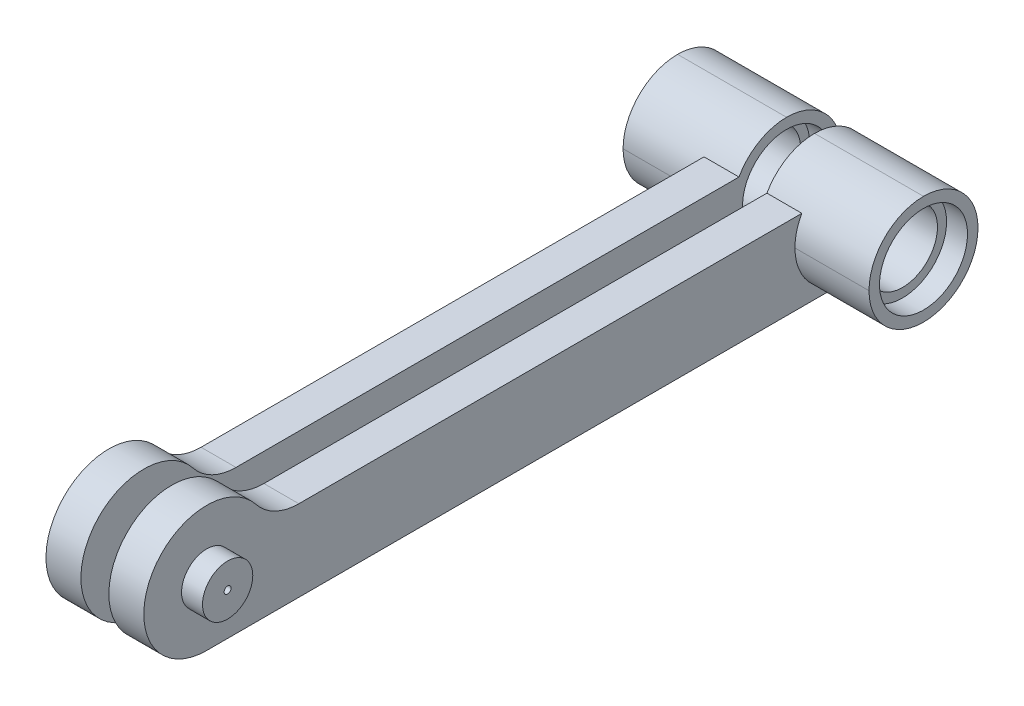
ISO-10303-21;
HEADER;
FILE_DESCRIPTION(('STEP AP214'),'2;1');
FILE_NAME('part.step','',(''),(''),'','','');
FILE_SCHEMA(('AUTOMOTIVE_DESIGN { 1 0 10303 214 1 1 1 1 }'));
ENDSEC;
DATA;
#1=APPLICATION_CONTEXT('core data for automotive mechanical design processes');
#2=APPLICATION_PROTOCOL_DEFINITION('international standard','automotive_design',2000,#1);
#3=PRODUCT_CONTEXT('',#1,'mechanical');
#4=PRODUCT('Part','Part','',(#3));
#5=PRODUCT_RELATED_PRODUCT_CATEGORY('part','',(#4));
#6=PRODUCT_DEFINITION_FORMATION('','',#4);
#7=PRODUCT_DEFINITION_CONTEXT('part definition',#1,'design');
#8=PRODUCT_DEFINITION('design','',#6,#7);
#9=PRODUCT_DEFINITION_SHAPE('','',#8);
#10=(LENGTH_UNIT() NAMED_UNIT(*) SI_UNIT(.MILLI.,.METRE.));
#11=(NAMED_UNIT(*) PLANE_ANGLE_UNIT() SI_UNIT($,.RADIAN.));
#12=(NAMED_UNIT(*) SI_UNIT($,.STERADIAN.) SOLID_ANGLE_UNIT());
#13=UNCERTAINTY_MEASURE_WITH_UNIT(LENGTH_MEASURE(1.E-05),#10,'distance_accuracy_value','');
#14=(GEOMETRIC_REPRESENTATION_CONTEXT(3) GLOBAL_UNCERTAINTY_ASSIGNED_CONTEXT((#13)) GLOBAL_UNIT_ASSIGNED_CONTEXT((#10,
#11,#12)) REPRESENTATION_CONTEXT('',''));
#15=CARTESIAN_POINT('',(0.,0.,0.));
#16=DIRECTION('',(0.,0.,1.));
#17=DIRECTION('',(1.,0.,0.));
#18=AXIS2_PLACEMENT_3D('',#15,#16,#17);
#19=CARTESIAN_POINT('',(-2.,0.,0.));
#20=DIRECTION('',(-1.,0.,0.));
#21=DIRECTION('',(0.,0.,-1.));
#22=AXIS2_PLACEMENT_3D('',#19,#20,#21);
#23=PLANE('',#22);
#24=CARTESIAN_POINT('',(-2.,-0.6,-46.));
#25=DIRECTION('',(1.,0.,0.));
#26=DIRECTION('',(0.,0.,-1.));
#27=AXIS2_PLACEMENT_3D('',#24,#25,#26);
#28=CIRCLE('',#27,3.15);
#29=CARTESIAN_POINT('',(-2.,-0.6,-49.15));
#30=VERTEX_POINT('',#29);
#31=EDGE_CURVE('E226',#30,#30,#28,.T.);
#32=ORIENTED_EDGE('',*,*,#31,.F.);
#33=EDGE_LOOP('',(#32));
#34=FACE_BOUND('',#33,.T.);
#35=DIRECTION('',(0.,0.,1.));
#36=VECTOR('',#35,1.);
#37=CARTESIAN_POINT('',(-2.,1.3,0.));
#38=LINE('',#37,#36);
#39=CARTESIAN_POINT('',(-2.,1.3,-42.5941227268147));
#40=VERTEX_POINT('',#39);
#41=CARTESIAN_POINT('',(-2.,1.3,-6.59696900098826));
#42=VERTEX_POINT('',#41);
#43=EDGE_CURVE('E212',#40,#42,#38,.T.);
#44=ORIENTED_EDGE('',*,*,#43,.T.);
#45=CARTESIAN_POINT('',(-2.,5.2,-6.59696900098826));
#46=DIRECTION('',(1.,0.,0.));
#47=DIRECTION('',(0.,0.,-1.));
#48=AXIS2_PLACEMENT_3D('',#45,#46,#47);
#49=CIRCLE('',#48,3.9);
#50=CARTESIAN_POINT('',(-2.,2.78571428571429,-3.53409053624371));
#51=VERTEX_POINT('',#50);
#52=EDGE_CURVE('E169',#51,#42,#49,.T.);
#53=ORIENTED_EDGE('',*,*,#52,.F.);
#54=CARTESIAN_POINT('',(-2.,0.,0.));
#55=DIRECTION('',(1.,0.,0.));
#56=DIRECTION('',(0.,0.,-1.));
#57=AXIS2_PLACEMENT_3D('',#54,#55,#56);
#58=CIRCLE('',#57,4.5);
#59=CARTESIAN_POINT('',(-2.,-4.5,0.));
#60=VERTEX_POINT('',#59);
#61=EDGE_CURVE('E147',#51,#60,#58,.T.);
#62=ORIENTED_EDGE('',*,*,#61,.T.);
#63=DIRECTION('',(0.,0.,-1.));
#64=VECTOR('',#63,1.);
#65=CARTESIAN_POINT('',(-2.,-4.5,0.));
#66=LINE('',#65,#64);
#67=CARTESIAN_POINT('',(-2.,-4.5,-46.));
#68=VERTEX_POINT('',#67);
#69=EDGE_CURVE('E157',#60,#68,#66,.T.);
#70=ORIENTED_EDGE('',*,*,#69,.T.);
#71=CARTESIAN_POINT('',(-2.,-0.6,-46.));
#72=DIRECTION('',(1.,0.,0.));
#73=DIRECTION('',(0.,0.,-1.));
#74=AXIS2_PLACEMENT_3D('',#71,#72,#73);
#75=CIRCLE('',#74,3.9);
#76=CARTESIAN_POINT('',(-2.,-0.6,-49.9));
#77=VERTEX_POINT('',#76);
#78=EDGE_CURVE('E196',#77,#68,#75,.F.);
#79=ORIENTED_EDGE('',*,*,#78,.F.);
#80=CARTESIAN_POINT('',(-2.,-0.6,-46.));
#81=DIRECTION('',(1.,0.,0.));
#82=DIRECTION('',(0.,0.,-1.));
#83=AXIS2_PLACEMENT_3D('',#80,#81,#82);
#84=CIRCLE('',#83,3.9);
#85=CARTESIAN_POINT('',(-2.,3.3,-46.));
#86=VERTEX_POINT('',#85);
#87=EDGE_CURVE('E193',#86,#77,#84,.F.);
#88=ORIENTED_EDGE('',*,*,#87,.F.);
#89=CARTESIAN_POINT('',(-2.,-0.6,-46.));
#90=DIRECTION('',(1.,0.,0.));
#91=DIRECTION('',(0.,0.,-1.));
#92=AXIS2_PLACEMENT_3D('',#89,#90,#91);
#93=CIRCLE('',#92,3.9);
#94=EDGE_CURVE('E198',#40,#86,#93,.F.);
#95=ORIENTED_EDGE('',*,*,#94,.F.);
#96=EDGE_LOOP('',(#44,#53,#62,#70,#79,#88,#95));
#97=FACE_BOUND('',#96,.T.);
#98=ADVANCED_FACE('F74',(#34,#97),#23,.F.);
#99=CARTESIAN_POINT('',(-4.5,0.,0.));
#100=DIRECTION('',(-1.,0.,0.));
#101=DIRECTION('',(0.,0.,-1.));
#102=AXIS2_PLACEMENT_3D('',#99,#100,#101);
#103=PLANE('',#102);
#104=CARTESIAN_POINT('',(-4.5,0.,0.));
#105=DIRECTION('',(1.,0.,0.));
#106=DIRECTION('',(0.,0.,-1.));
#107=AXIS2_PLACEMENT_3D('',#104,#105,#106);
#108=CIRCLE('',#107,1.8);
#109=CARTESIAN_POINT('',(-4.5,0.,-1.8));
#110=VERTEX_POINT('',#109);
#111=EDGE_CURVE('E240',#110,#110,#108,.T.);
#112=ORIENTED_EDGE('',*,*,#111,.T.);
#113=EDGE_LOOP('',(#112));
#114=FACE_BOUND('',#113,.T.);
#115=DIRECTION('',(0.,0.,-1.));
#116=VECTOR('',#115,1.);
#117=CARTESIAN_POINT('',(-4.5,1.3,0.));
#118=LINE('',#117,#116);
#119=CARTESIAN_POINT('',(-4.5,1.3,-6.59696900098826));
#120=VERTEX_POINT('',#119);
#121=CARTESIAN_POINT('',(-4.5,1.3,-42.5941227268147));
#122=VERTEX_POINT('',#121);
#123=EDGE_CURVE('E213',#120,#122,#118,.T.);
#124=ORIENTED_EDGE('',*,*,#123,.T.);
#125=CARTESIAN_POINT('',(-4.5,-0.6,-46.));
#126=DIRECTION('',(1.,0.,0.));
#127=DIRECTION('',(0.,0.,-1.));
#128=AXIS2_PLACEMENT_3D('',#125,#126,#127);
#129=CIRCLE('',#128,3.9);
#130=CARTESIAN_POINT('',(-4.5,-0.6,-42.1));
#131=VERTEX_POINT('',#130);
#132=EDGE_CURVE('E83',#131,#122,#129,.F.);
#133=ORIENTED_EDGE('',*,*,#132,.F.);
#134=CARTESIAN_POINT('',(-4.5,-0.6,-46.));
#135=DIRECTION('',(1.,0.,0.));
#136=DIRECTION('',(0.,0.,-1.));
#137=AXIS2_PLACEMENT_3D('',#134,#135,#136);
#138=CIRCLE('',#137,3.9);
#139=CARTESIAN_POINT('',(-4.5,-4.5,-46.));
#140=VERTEX_POINT('',#139);
#141=EDGE_CURVE('E205',#140,#131,#138,.F.);
#142=ORIENTED_EDGE('',*,*,#141,.F.);
#143=DIRECTION('',(0.,0.,-1.));
#144=VECTOR('',#143,1.);
#145=CARTESIAN_POINT('',(-4.5,-4.5,0.));
#146=LINE('',#145,#144);
#147=CARTESIAN_POINT('',(-4.5,-4.5,0.));
#148=VERTEX_POINT('',#147);
#149=EDGE_CURVE('E164',#148,#140,#146,.T.);
#150=ORIENTED_EDGE('',*,*,#149,.F.);
#151=CARTESIAN_POINT('',(-4.5,0.,0.));
#152=DIRECTION('',(1.,0.,0.));
#153=DIRECTION('',(0.,0.,-1.));
#154=AXIS2_PLACEMENT_3D('',#151,#152,#153);
#155=CIRCLE('',#154,4.5);
#156=CARTESIAN_POINT('',(-4.5,2.78571428571429,-3.53409053624371));
#157=VERTEX_POINT('',#156);
#158=EDGE_CURVE('E150',#157,#148,#155,.T.);
#159=ORIENTED_EDGE('',*,*,#158,.F.);
#160=CARTESIAN_POINT('',(-4.5,5.2,-6.59696900098826));
#161=DIRECTION('',(1.,0.,0.));
#162=DIRECTION('',(0.,0.,-1.));
#163=AXIS2_PLACEMENT_3D('',#160,#161,#162);
#164=CIRCLE('',#163,3.9);
#165=EDGE_CURVE('E202',#120,#157,#164,.F.);
#166=ORIENTED_EDGE('',*,*,#165,.F.);
#167=EDGE_LOOP('',(#124,#133,#142,#150,#159,#166));
#168=FACE_BOUND('',#167,.T.);
#169=ADVANCED_FACE('F245',(#114,#168),#103,.T.);
#170=CARTESIAN_POINT('',(-9.8,-0.6,-46.));
#171=DIRECTION('',(1.,0.,0.));
#172=DIRECTION('',(0.,0.,1.));
#173=AXIS2_PLACEMENT_3D('',#170,#171,#172);
#174=CYLINDRICAL_SURFACE('',#173,2.5);
#175=CARTESIAN_POINT('',(-3.5,-0.6,-46.));
#176=DIRECTION('',(1.,0.,0.));
#177=DIRECTION('',(0.,0.,-1.));
#178=AXIS2_PLACEMENT_3D('',#175,#176,#177);
#179=CIRCLE('',#178,2.5);
#180=CARTESIAN_POINT('',(-3.5,-0.6,-48.5));
#181=VERTEX_POINT('',#180);
#182=EDGE_CURVE('E229',#181,#181,#179,.T.);
#183=ORIENTED_EDGE('',*,*,#182,.T.);
#184=EDGE_LOOP('',(#183));
#185=FACE_BOUND('',#184,.T.);
#186=CARTESIAN_POINT('',(-8.3,-0.6,-46.));
#187=DIRECTION('',(1.,0.,0.));
#188=DIRECTION('',(0.,0.,-1.));
#189=AXIS2_PLACEMENT_3D('',#186,#187,#188);
#190=CIRCLE('',#189,2.5);
#191=CARTESIAN_POINT('',(-8.3,-0.6,-48.5));
#192=VERTEX_POINT('',#191);
#193=EDGE_CURVE('E217',#192,#192,#190,.T.);
#194=ORIENTED_EDGE('',*,*,#193,.F.);
#195=EDGE_LOOP('',(#194));
#196=FACE_BOUND('',#195,.T.);
#197=ADVANCED_FACE('F270',(#185,#196),#174,.F.);
#198=CARTESIAN_POINT('',(-4.5,0.,0.));
#199=DIRECTION('',(1.,0.,0.));
#200=DIRECTION('',(0.,0.,1.));
#201=AXIS2_PLACEMENT_3D('',#198,#199,#200);
#202=CYLINDRICAL_SURFACE('',#201,4.5);
#203=ORIENTED_EDGE('',*,*,#158,.T.);
#204=DIRECTION('',(1.,0.,0.));
#205=VECTOR('',#204,1.);
#206=CARTESIAN_POINT('',(-4.5,-4.5,0.));
#207=LINE('',#206,#205);
#208=EDGE_CURVE('E143',#148,#60,#207,.T.);
#209=ORIENTED_EDGE('',*,*,#208,.T.);
#210=ORIENTED_EDGE('',*,*,#61,.F.);
#211=DIRECTION('',(1.,0.,0.));
#212=VECTOR('',#211,1.);
#213=CARTESIAN_POINT('',(-4.5,2.78571428571429,-3.53409053624371));
#214=LINE('',#213,#212);
#215=EDGE_CURVE('E177',#157,#51,#214,.T.);
#216=ORIENTED_EDGE('',*,*,#215,.F.);
#217=EDGE_LOOP('',(#203,#209,#210,#216));
#218=FACE_BOUND('',#217,.T.);
#219=ADVANCED_FACE('F145',(#218),#202,.T.);
#220=CARTESIAN_POINT('',(-4.5,-4.5,0.));
#221=DIRECTION('',(0.,1.,0.));
#222=DIRECTION('',(0.,0.,1.));
#223=AXIS2_PLACEMENT_3D('',#220,#221,#222);
#224=PLANE('',#223);
#225=DIRECTION('',(1.,0.,0.));
#226=VECTOR('',#225,1.);
#227=CARTESIAN_POINT('',(-4.5,-4.5,-46.));
#228=LINE('',#227,#226);
#229=EDGE_CURVE('E160',#68,#140,#228,.F.);
#230=ORIENTED_EDGE('',*,*,#229,.F.);
#231=ORIENTED_EDGE('',*,*,#69,.F.);
#232=ORIENTED_EDGE('',*,*,#208,.F.);
#233=ORIENTED_EDGE('',*,*,#149,.T.);
#234=EDGE_LOOP('',(#230,#231,#232,#233));
#235=FACE_BOUND('',#234,.T.);
#236=ADVANCED_FACE('F158',(#235),#224,.F.);
#237=CARTESIAN_POINT('',(-6.,0.,0.));
#238=DIRECTION('',(-1.,0.,0.));
#239=DIRECTION('',(0.,0.,-1.));
#240=AXIS2_PLACEMENT_3D('',#237,#238,#239);
#241=PLANE('',#240);
#242=CARTESIAN_POINT('',(-6.,0.,0.));
#243=DIRECTION('',(1.,0.,0.));
#244=DIRECTION('',(0.,0.,-1.));
#245=AXIS2_PLACEMENT_3D('',#242,#243,#244);
#246=CIRCLE('',#245,1.8);
#247=CARTESIAN_POINT('',(-6.,0.,-1.8));
#248=VERTEX_POINT('',#247);
#249=EDGE_CURVE('E165',#248,#248,#246,.T.);
#250=ORIENTED_EDGE('',*,*,#249,.F.);
#251=EDGE_LOOP('',(#250));
#252=FACE_BOUND('',#251,.T.);
#253=CARTESIAN_POINT('',(-6.,0.,0.));
#254=DIRECTION('',(1.,0.,0.));
#255=DIRECTION('',(0.,0.,-1.));
#256=AXIS2_PLACEMENT_3D('',#253,#254,#255);
#257=CIRCLE('',#256,0.25);
#258=CARTESIAN_POINT('',(-6.,0.,-0.25));
#259=VERTEX_POINT('',#258);
#260=EDGE_CURVE('E235',#259,#259,#257,.T.);
#261=ORIENTED_EDGE('',*,*,#260,.T.);
#262=EDGE_LOOP('',(#261));
#263=FACE_BOUND('',#262,.T.);
#264=ADVANCED_FACE('F251',(#252,#263),#241,.T.);
#265=CARTESIAN_POINT('',(-6.,0.,0.));
#266=DIRECTION('',(1.,0.,0.));
#267=DIRECTION('',(0.,0.,1.));
#268=AXIS2_PLACEMENT_3D('',#265,#266,#267);
#269=CYLINDRICAL_SURFACE('',#268,1.8);
#270=ORIENTED_EDGE('',*,*,#249,.T.);
#271=EDGE_LOOP('',(#270));
#272=FACE_BOUND('',#271,.T.);
#273=ORIENTED_EDGE('',*,*,#111,.F.);
#274=EDGE_LOOP('',(#273));
#275=FACE_BOUND('',#274,.T.);
#276=ADVANCED_FACE('F248',(#272,#275),#269,.T.);
#277=CARTESIAN_POINT('',(-6.,0.,0.));
#278=DIRECTION('',(1.,0.,0.));
#279=DIRECTION('',(0.,0.,1.));
#280=AXIS2_PLACEMENT_3D('',#277,#278,#279);
#281=CYLINDRICAL_SURFACE('',#280,0.25);
#282=ORIENTED_EDGE('',*,*,#260,.F.);
#283=EDGE_LOOP('',(#282));
#284=FACE_BOUND('',#283,.T.);
#285=CARTESIAN_POINT('',(-4.5,0.,0.));
#286=DIRECTION('',(1.,0.,0.));
#287=DIRECTION('',(0.,0.,-1.));
#288=AXIS2_PLACEMENT_3D('',#285,#286,#287);
#289=CIRCLE('',#288,0.25);
#290=CARTESIAN_POINT('',(-4.5,0.,-0.25));
#291=VERTEX_POINT('',#290);
#292=EDGE_CURVE('E154',#291,#291,#289,.F.);
#293=ORIENTED_EDGE('',*,*,#292,.F.);
#294=EDGE_LOOP('',(#293));
#295=FACE_BOUND('',#294,.T.);
#296=ADVANCED_FACE('F250',(#284,#295),#281,.F.);
#297=ORIENTED_EDGE('',*,*,#292,.T.);
#298=EDGE_LOOP('',(#297));
#299=FACE_BOUND('',#298,.T.);
#300=ADVANCED_FACE('F258',(#299),#103,.T.);
#301=CARTESIAN_POINT('',(-9.8,0.,0.));
#302=DIRECTION('',(-1.,0.,0.));
#303=DIRECTION('',(0.,0.,-1.));
#304=AXIS2_PLACEMENT_3D('',#301,#302,#303);
#305=PLANE('',#304);
#306=CARTESIAN_POINT('',(-9.8,-0.6,-46.));
#307=DIRECTION('',(1.,0.,0.));
#308=DIRECTION('',(0.,0.,-1.));
#309=AXIS2_PLACEMENT_3D('',#306,#307,#308);
#310=CIRCLE('',#309,3.15);
#311=CARTESIAN_POINT('',(-9.8,-0.6,-49.15));
#312=VERTEX_POINT('',#311);
#313=EDGE_CURVE('E222',#312,#312,#310,.T.);
#314=ORIENTED_EDGE('',*,*,#313,.T.);
#315=EDGE_LOOP('',(#314));
#316=FACE_BOUND('',#315,.T.);
#317=CARTESIAN_POINT('',(-9.8,-0.6,-46.));
#318=DIRECTION('',(1.,0.,0.));
#319=DIRECTION('',(0.,0.,-1.));
#320=AXIS2_PLACEMENT_3D('',#317,#318,#319);
#321=CIRCLE('',#320,3.9);
#322=CARTESIAN_POINT('',(-9.8,3.3,-46.));
#323=VERTEX_POINT('',#322);
#324=CARTESIAN_POINT('',(-9.8,-0.6,-42.1));
#325=VERTEX_POINT('',#324);
#326=EDGE_CURVE('E188',#323,#325,#321,.T.);
#327=ORIENTED_EDGE('',*,*,#326,.F.);
#328=CARTESIAN_POINT('',(-9.8,-0.6,-46.));
#329=DIRECTION('',(1.,0.,0.));
#330=DIRECTION('',(0.,0.,-1.));
#331=AXIS2_PLACEMENT_3D('',#328,#329,#330);
#332=CIRCLE('',#331,3.9);
#333=CARTESIAN_POINT('',(-9.8,-0.6,-49.9));
#334=VERTEX_POINT('',#333);
#335=EDGE_CURVE('E182',#334,#323,#332,.T.);
#336=ORIENTED_EDGE('',*,*,#335,.F.);
#337=CARTESIAN_POINT('',(-9.8,-0.6,-46.));
#338=DIRECTION('',(1.,0.,0.));
#339=DIRECTION('',(0.,0.,-1.));
#340=AXIS2_PLACEMENT_3D('',#337,#338,#339);
#341=CIRCLE('',#340,3.9);
#342=CARTESIAN_POINT('',(-9.8,-4.5,-46.));
#343=VERTEX_POINT('',#342);
#344=EDGE_CURVE('E185',#343,#334,#341,.T.);
#345=ORIENTED_EDGE('',*,*,#344,.F.);
#346=CARTESIAN_POINT('',(-9.8,-0.6,-46.));
#347=DIRECTION('',(1.,0.,0.));
#348=DIRECTION('',(0.,0.,-1.));
#349=AXIS2_PLACEMENT_3D('',#346,#347,#348);
#350=CIRCLE('',#349,3.9);
#351=EDGE_CURVE('E190',#325,#343,#350,.T.);
#352=ORIENTED_EDGE('',*,*,#351,.F.);
#353=EDGE_LOOP('',(#327,#336,#345,#352));
#354=FACE_BOUND('',#353,.T.);
#355=ADVANCED_FACE('F303',(#316,#354),#305,.T.);
#356=CARTESIAN_POINT('',(-3.5,-0.6,-46.));
#357=DIRECTION('',(1.,0.,0.));
#358=DIRECTION('',(0.,0.,1.));
#359=AXIS2_PLACEMENT_3D('',#356,#357,#358);
#360=CYLINDRICAL_SURFACE('',#359,3.15);
#361=CARTESIAN_POINT('',(-3.5,-0.6,-46.));
#362=DIRECTION('',(1.,0.,0.));
#363=DIRECTION('',(0.,0.,-1.));
#364=AXIS2_PLACEMENT_3D('',#361,#362,#363);
#365=CIRCLE('',#364,3.15);
#366=CARTESIAN_POINT('',(-3.5,-0.6,-49.15));
#367=VERTEX_POINT('',#366);
#368=EDGE_CURVE('E232',#367,#367,#365,.T.);
#369=ORIENTED_EDGE('',*,*,#368,.F.);
#370=EDGE_LOOP('',(#369));
#371=FACE_BOUND('',#370,.T.);
#372=ORIENTED_EDGE('',*,*,#31,.T.);
#373=EDGE_LOOP('',(#372));
#374=FACE_BOUND('',#373,.T.);
#375=ADVANCED_FACE('F305',(#371,#374),#360,.F.);
#376=CARTESIAN_POINT('',(-3.5,0.,0.));
#377=DIRECTION('',(-1.,0.,0.));
#378=DIRECTION('',(0.,0.,-1.));
#379=AXIS2_PLACEMENT_3D('',#376,#377,#378);
#380=PLANE('',#379);
#381=ORIENTED_EDGE('',*,*,#182,.F.);
#382=EDGE_LOOP('',(#381));
#383=FACE_BOUND('',#382,.T.);
#384=ORIENTED_EDGE('',*,*,#368,.T.);
#385=EDGE_LOOP('',(#384));
#386=FACE_BOUND('',#385,.T.);
#387=ADVANCED_FACE('F312',(#383,#386),#380,.F.);
#388=CARTESIAN_POINT('',(-8.3,-0.6,-46.));
#389=DIRECTION('',(-1.,0.,0.));
#390=DIRECTION('',(0.,0.,-1.));
#391=AXIS2_PLACEMENT_3D('',#388,#389,#390);
#392=CYLINDRICAL_SURFACE('',#391,3.15);
#393=CARTESIAN_POINT('',(-8.3,-0.6,-46.));
#394=DIRECTION('',(1.,0.,0.));
#395=DIRECTION('',(0.,0.,-1.));
#396=AXIS2_PLACEMENT_3D('',#393,#394,#395);
#397=CIRCLE('',#396,3.15);
#398=CARTESIAN_POINT('',(-8.3,-0.6,-49.15));
#399=VERTEX_POINT('',#398);
#400=EDGE_CURVE('E223',#399,#399,#397,.T.);
#401=ORIENTED_EDGE('',*,*,#400,.T.);
#402=EDGE_LOOP('',(#401));
#403=FACE_BOUND('',#402,.T.);
#404=ORIENTED_EDGE('',*,*,#313,.F.);
#405=EDGE_LOOP('',(#404));
#406=FACE_BOUND('',#405,.T.);
#407=ADVANCED_FACE('F322',(#403,#406),#392,.F.);
#408=CARTESIAN_POINT('',(-8.3,-0.6,-46.));
#409=DIRECTION('',(-1.,0.,0.));
#410=DIRECTION('',(0.,0.,-1.));
#411=AXIS2_PLACEMENT_3D('',#408,#409,#410);
#412=PLANE('',#411);
#413=ORIENTED_EDGE('',*,*,#193,.T.);
#414=EDGE_LOOP('',(#413));
#415=FACE_BOUND('',#414,.T.);
#416=ORIENTED_EDGE('',*,*,#400,.F.);
#417=EDGE_LOOP('',(#416));
#418=FACE_BOUND('',#417,.T.);
#419=ADVANCED_FACE('F326',(#415,#418),#412,.T.);
#420=CARTESIAN_POINT('',(-9.8,1.3,0.));
#421=DIRECTION('',(0.,-1.,0.));
#422=DIRECTION('',(0.,0.,-1.));
#423=AXIS2_PLACEMENT_3D('',#420,#421,#422);
#424=PLANE('',#423);
#425=ORIENTED_EDGE('',*,*,#43,.F.);
#426=DIRECTION('',(1.,0.,0.));
#427=VECTOR('',#426,1.);
#428=CARTESIAN_POINT('',(-4.5,1.3,-42.5941227268147));
#429=LINE('',#428,#427);
#430=EDGE_CURVE('E13',#122,#40,#429,.T.);
#431=ORIENTED_EDGE('',*,*,#430,.F.);
#432=ORIENTED_EDGE('',*,*,#123,.F.);
#433=DIRECTION('',(-1.,0.,0.));
#434=VECTOR('',#433,1.);
#435=CARTESIAN_POINT('',(-4.5,1.3,-6.59696900098826));
#436=LINE('',#435,#434);
#437=EDGE_CURVE('E179',#42,#120,#436,.T.);
#438=ORIENTED_EDGE('',*,*,#437,.F.);
#439=EDGE_LOOP('',(#425,#431,#432,#438));
#440=FACE_BOUND('',#439,.T.);
#441=ADVANCED_FACE('F280',(#440),#424,.F.);
#442=CARTESIAN_POINT('',(-4.5,5.2,-6.59696900098826));
#443=DIRECTION('',(1.,0.,0.));
#444=DIRECTION('',(0.,0.,1.));
#445=AXIS2_PLACEMENT_3D('',#442,#443,#444);
#446=CYLINDRICAL_SURFACE('',#445,3.9);
#447=ORIENTED_EDGE('',*,*,#165,.T.);
#448=ORIENTED_EDGE('',*,*,#215,.T.);
#449=ORIENTED_EDGE('',*,*,#52,.T.);
#450=ORIENTED_EDGE('',*,*,#437,.T.);
#451=EDGE_LOOP('',(#447,#448,#449,#450));
#452=FACE_BOUND('',#451,.T.);
#453=ADVANCED_FACE('F277',(#452),#446,.F.);
#454=CARTESIAN_POINT('',(-4.5,-0.6,-46.));
#455=DIRECTION('',(-1.,0.,0.));
#456=DIRECTION('',(0.,0.,-1.));
#457=AXIS2_PLACEMENT_3D('',#454,#455,#456);
#458=CYLINDRICAL_SURFACE('',#457,3.9);
#459=DIRECTION('',(1.,0.,0.));
#460=VECTOR('',#459,1.);
#461=CARTESIAN_POINT('',(-9.8,-0.6,-49.9));
#462=LINE('',#461,#460);
#463=EDGE_CURVE('E210',#77,#334,#462,.F.);
#464=ORIENTED_EDGE('',*,*,#463,.T.);
#465=ORIENTED_EDGE('',*,*,#335,.T.);
#466=DIRECTION('',(1.,0.,0.));
#467=VECTOR('',#466,1.);
#468=CARTESIAN_POINT('',(-2.,3.3,-46.));
#469=LINE('',#468,#467);
#470=EDGE_CURVE('E78',#323,#86,#469,.T.);
#471=ORIENTED_EDGE('',*,*,#470,.T.);
#472=ORIENTED_EDGE('',*,*,#87,.T.);
#473=EDGE_LOOP('',(#464,#465,#471,#472));
#474=FACE_BOUND('',#473,.T.);
#475=ADVANCED_FACE('F76',(#474),#458,.T.);
#476=CARTESIAN_POINT('',(-9.8,-0.6,-46.));
#477=DIRECTION('',(1.,0.,0.));
#478=DIRECTION('',(0.,0.,1.));
#479=AXIS2_PLACEMENT_3D('',#476,#477,#478);
#480=CYLINDRICAL_SURFACE('',#479,3.9);
#481=ORIENTED_EDGE('',*,*,#430,.T.);
#482=ORIENTED_EDGE('',*,*,#94,.T.);
#483=ORIENTED_EDGE('',*,*,#470,.F.);
#484=ORIENTED_EDGE('',*,*,#326,.T.);
#485=DIRECTION('',(1.,0.,0.));
#486=VECTOR('',#485,1.);
#487=CARTESIAN_POINT('',(-9.8,-0.6,-42.1));
#488=LINE('',#487,#486);
#489=EDGE_CURVE('E96',#325,#131,#488,.T.);
#490=ORIENTED_EDGE('',*,*,#489,.T.);
#491=ORIENTED_EDGE('',*,*,#132,.T.);
#492=EDGE_LOOP('',(#481,#482,#483,#484,#490,#491));
#493=FACE_BOUND('',#492,.T.);
#494=ADVANCED_FACE('F288',(#493),#480,.T.);
#495=CARTESIAN_POINT('',(-4.5,-0.6,-46.));
#496=DIRECTION('',(1.,0.,0.));
#497=DIRECTION('',(0.,0.,1.));
#498=AXIS2_PLACEMENT_3D('',#495,#496,#497);
#499=CYLINDRICAL_SURFACE('',#498,3.9);
#500=ORIENTED_EDGE('',*,*,#463,.F.);
#501=ORIENTED_EDGE('',*,*,#78,.T.);
#502=ORIENTED_EDGE('',*,*,#229,.T.);
#503=DIRECTION('',(1.,0.,0.));
#504=VECTOR('',#503,1.);
#505=CARTESIAN_POINT('',(-4.5,-4.5,-46.));
#506=LINE('',#505,#504);
#507=EDGE_CURVE('E208',#140,#343,#506,.F.);
#508=ORIENTED_EDGE('',*,*,#507,.T.);
#509=ORIENTED_EDGE('',*,*,#344,.T.);
#510=EDGE_LOOP('',(#500,#501,#502,#508,#509));
#511=FACE_BOUND('',#510,.T.);
#512=ADVANCED_FACE('F285',(#511),#499,.T.);
#513=CARTESIAN_POINT('',(-4.5,-0.6,-46.));
#514=DIRECTION('',(-1.,0.,0.));
#515=DIRECTION('',(0.,0.,-1.));
#516=AXIS2_PLACEMENT_3D('',#513,#514,#515);
#517=CYLINDRICAL_SURFACE('',#516,3.9);
#518=ORIENTED_EDGE('',*,*,#351,.T.);
#519=ORIENTED_EDGE('',*,*,#507,.F.);
#520=ORIENTED_EDGE('',*,*,#141,.T.);
#521=ORIENTED_EDGE('',*,*,#489,.F.);
#522=EDGE_LOOP('',(#518,#519,#520,#521));
#523=FACE_BOUND('',#522,.T.);
#524=ADVANCED_FACE('F282',(#523),#517,.T.);
#525=CLOSED_SHELL('',(#98,#169,#197,#219,#236,#264,#276,#296,#300,#355,#375,#387,#407,#419,#441,
#453,#475,#494,#512,#524));
#526=MANIFOLD_SOLID_BREP('B2',#525);
#527=CARTESIAN_POINT('',(0.,0.,0.));
#528=DIRECTION('',(1.,0.,0.));
#529=DIRECTION('',(0.,0.,-1.));
#530=AXIS2_PLACEMENT_3D('',#527,#528,#529);
#531=PLANE('',#530);
#532=CARTESIAN_POINT('',(0.,-0.6,-46.));
#533=DIRECTION('',(1.,0.,0.));
#534=DIRECTION('',(0.,0.,-1.));
#535=AXIS2_PLACEMENT_3D('',#532,#533,#534);
#536=CIRCLE('',#535,3.15);
#537=CARTESIAN_POINT('',(0.,-0.6,-49.15));
#538=VERTEX_POINT('',#537);
#539=EDGE_CURVE('E634',#538,#538,#536,.T.);
#540=ORIENTED_EDGE('',*,*,#539,.T.);
#541=EDGE_LOOP('',(#540));
#542=FACE_BOUND('',#541,.T.);
#543=DIRECTION('',(0.,0.,1.));
#544=VECTOR('',#543,1.);
#545=CARTESIAN_POINT('',(0.,1.3,0.));
#546=LINE('',#545,#544);
#547=CARTESIAN_POINT('',(0.,1.3,-42.5941227268147));
#548=VERTEX_POINT('',#547);
#549=CARTESIAN_POINT('',(0.,1.3,-6.59696900098826));
#550=VERTEX_POINT('',#549);
#551=EDGE_CURVE('E617',#548,#550,#546,.T.);
#552=ORIENTED_EDGE('',*,*,#551,.F.);
#553=CARTESIAN_POINT('',(0.,-0.6,-46.));
#554=DIRECTION('',(1.,0.,0.));
#555=DIRECTION('',(0.,0.,-1.));
#556=AXIS2_PLACEMENT_3D('',#553,#554,#555);
#557=CIRCLE('',#556,3.9);
#558=CARTESIAN_POINT('',(0.,3.3,-46.));
#559=VERTEX_POINT('',#558);
#560=EDGE_CURVE('E599',#548,#559,#557,.F.);
#561=ORIENTED_EDGE('',*,*,#560,.T.);
#562=CARTESIAN_POINT('',(0.,-0.6,-46.));
#563=DIRECTION('',(1.,0.,0.));
#564=DIRECTION('',(0.,0.,-1.));
#565=AXIS2_PLACEMENT_3D('',#562,#563,#564);
#566=CIRCLE('',#565,3.9);
#567=CARTESIAN_POINT('',(0.,-0.6,-49.9));
#568=VERTEX_POINT('',#567);
#569=EDGE_CURVE('E596',#559,#568,#566,.F.);
#570=ORIENTED_EDGE('',*,*,#569,.T.);
#571=CARTESIAN_POINT('',(0.,-0.6,-46.));
#572=DIRECTION('',(1.,0.,0.));
#573=DIRECTION('',(0.,0.,-1.));
#574=AXIS2_PLACEMENT_3D('',#571,#572,#573);
#575=CIRCLE('',#574,3.9);
#576=CARTESIAN_POINT('',(0.,-4.5,-46.));
#577=VERTEX_POINT('',#576);
#578=EDGE_CURVE('E572',#568,#577,#575,.F.);
#579=ORIENTED_EDGE('',*,*,#578,.T.);
#580=DIRECTION('',(0.,0.,-1.));
#581=VECTOR('',#580,1.);
#582=CARTESIAN_POINT('',(0.,-4.5,0.));
#583=LINE('',#582,#581);
#584=CARTESIAN_POINT('',(0.,-4.5,0.));
#585=VERTEX_POINT('',#584);
#586=EDGE_CURVE('E567',#585,#577,#583,.T.);
#587=ORIENTED_EDGE('',*,*,#586,.F.);
#588=CARTESIAN_POINT('',(0.,0.,0.));
#589=DIRECTION('',(1.,0.,0.));
#590=DIRECTION('',(0.,0.,-1.));
#591=AXIS2_PLACEMENT_3D('',#588,#589,#590);
#592=CIRCLE('',#591,4.5);
#593=CARTESIAN_POINT('',(0.,2.78571428571429,-3.53409053624371));
#594=VERTEX_POINT('',#593);
#595=EDGE_CURVE('E550',#594,#585,#592,.T.);
#596=ORIENTED_EDGE('',*,*,#595,.F.);
#597=CARTESIAN_POINT('',(0.,5.2,-6.59696900098826));
#598=DIRECTION('',(1.,0.,0.));
#599=DIRECTION('',(0.,0.,-1.));
#600=AXIS2_PLACEMENT_3D('',#597,#598,#599);
#601=CIRCLE('',#600,3.9);
#602=EDGE_CURVE('E601',#594,#550,#601,.T.);
#603=ORIENTED_EDGE('',*,*,#602,.T.);
#604=EDGE_LOOP('',(#552,#561,#570,#579,#587,#596,#603));
#605=FACE_BOUND('',#604,.T.);
#606=ADVANCED_FACE('F477',(#542,#605),#531,.F.);
#607=CARTESIAN_POINT('',(2.5,0.,0.));
#608=DIRECTION('',(1.,0.,0.));
#609=DIRECTION('',(0.,0.,-1.));
#610=AXIS2_PLACEMENT_3D('',#607,#608,#609);
#611=PLANE('',#610);
#612=CARTESIAN_POINT('',(2.5,0.,0.));
#613=DIRECTION('',(1.,0.,0.));
#614=DIRECTION('',(0.,0.,-1.));
#615=AXIS2_PLACEMENT_3D('',#612,#613,#614);
#616=CIRCLE('',#615,1.8);
#617=CARTESIAN_POINT('',(2.5,0.,-1.8));
#618=VERTEX_POINT('',#617);
#619=EDGE_CURVE('E577',#618,#618,#616,.T.);
#620=ORIENTED_EDGE('',*,*,#619,.F.);
#621=EDGE_LOOP('',(#620));
#622=FACE_BOUND('',#621,.T.);
#623=DIRECTION('',(0.,0.,-1.));
#624=VECTOR('',#623,1.);
#625=CARTESIAN_POINT('',(2.5,1.3,0.));
#626=LINE('',#625,#624);
#627=CARTESIAN_POINT('',(2.5,1.3,-6.59696900098826));
#628=VERTEX_POINT('',#627);
#629=CARTESIAN_POINT('',(2.5,1.3,-42.5941227268147));
#630=VERTEX_POINT('',#629);
#631=EDGE_CURVE('E493',#628,#630,#626,.T.);
#632=ORIENTED_EDGE('',*,*,#631,.F.);
#633=CARTESIAN_POINT('',(2.5,5.2,-6.59696900098826));
#634=DIRECTION('',(1.,0.,0.));
#635=DIRECTION('',(0.,0.,-1.));
#636=AXIS2_PLACEMENT_3D('',#633,#634,#635);
#637=CIRCLE('',#636,3.9);
#638=CARTESIAN_POINT('',(2.5,2.78571428571429,-3.53409053624371));
#639=VERTEX_POINT('',#638);
#640=EDGE_CURVE('E603',#628,#639,#637,.F.);
#641=ORIENTED_EDGE('',*,*,#640,.T.);
#642=CARTESIAN_POINT('',(2.5,0.,0.));
#643=DIRECTION('',(1.,0.,0.));
#644=DIRECTION('',(0.,0.,-1.));
#645=AXIS2_PLACEMENT_3D('',#642,#643,#644);
#646=CIRCLE('',#645,4.5);
#647=CARTESIAN_POINT('',(2.5,-4.5,0.));
#648=VERTEX_POINT('',#647);
#649=EDGE_CURVE('E560',#639,#648,#646,.T.);
#650=ORIENTED_EDGE('',*,*,#649,.T.);
#651=DIRECTION('',(0.,0.,-1.));
#652=VECTOR('',#651,1.);
#653=CARTESIAN_POINT('',(2.5,-4.5,0.));
#654=LINE('',#653,#652);
#655=CARTESIAN_POINT('',(2.5,-4.5,-46.));
#656=VERTEX_POINT('',#655);
#657=EDGE_CURVE('E561',#648,#656,#654,.T.);
#658=ORIENTED_EDGE('',*,*,#657,.T.);
#659=CARTESIAN_POINT('',(2.5,-0.6,-46.));
#660=DIRECTION('',(1.,0.,0.));
#661=DIRECTION('',(0.,0.,-1.));
#662=AXIS2_PLACEMENT_3D('',#659,#660,#661);
#663=CIRCLE('',#662,3.9);
#664=CARTESIAN_POINT('',(2.5,-0.6,-42.1));
#665=VERTEX_POINT('',#664);
#666=EDGE_CURVE('E605',#656,#665,#663,.F.);
#667=ORIENTED_EDGE('',*,*,#666,.T.);
#668=CARTESIAN_POINT('',(2.5,-0.6,-46.));
#669=DIRECTION('',(1.,0.,0.));
#670=DIRECTION('',(0.,0.,-1.));
#671=AXIS2_PLACEMENT_3D('',#668,#669,#670);
#672=CIRCLE('',#671,3.9);
#673=EDGE_CURVE('E486',#665,#630,#672,.F.);
#674=ORIENTED_EDGE('',*,*,#673,.T.);
#675=EDGE_LOOP('',(#632,#641,#650,#658,#667,#674));
#676=FACE_BOUND('',#675,.T.);
#677=ADVANCED_FACE('F651',(#622,#676),#611,.T.);
#678=CARTESIAN_POINT('',(7.8,-0.6,-46.));
#679=DIRECTION('',(-1.,0.,0.));
#680=DIRECTION('',(0.,0.,1.));
#681=AXIS2_PLACEMENT_3D('',#678,#679,#680);
#682=CYLINDRICAL_SURFACE('',#681,2.5);
#683=CARTESIAN_POINT('',(1.5,-0.6,-46.));
#684=DIRECTION('',(1.,0.,0.));
#685=DIRECTION('',(0.,0.,-1.));
#686=AXIS2_PLACEMENT_3D('',#683,#684,#685);
#687=CIRCLE('',#686,2.5);
#688=CARTESIAN_POINT('',(1.5,-0.6,-48.5));
#689=VERTEX_POINT('',#688);
#690=EDGE_CURVE('E637',#689,#689,#687,.T.);
#691=ORIENTED_EDGE('',*,*,#690,.F.);
#692=EDGE_LOOP('',(#691));
#693=FACE_BOUND('',#692,.T.);
#694=CARTESIAN_POINT('',(6.3,-0.6,-46.));
#695=DIRECTION('',(1.,0.,0.));
#696=DIRECTION('',(0.,0.,-1.));
#697=AXIS2_PLACEMENT_3D('',#694,#695,#696);
#698=CIRCLE('',#697,2.5);
#699=CARTESIAN_POINT('',(6.3,-0.6,-48.5));
#700=VERTEX_POINT('',#699);
#701=EDGE_CURVE('E625',#700,#700,#698,.T.);
#702=ORIENTED_EDGE('',*,*,#701,.T.);
#703=EDGE_LOOP('',(#702));
#704=FACE_BOUND('',#703,.T.);
#705=ADVANCED_FACE('F674',(#693,#704),#682,.F.);
#706=CARTESIAN_POINT('',(2.5,0.,0.));
#707=DIRECTION('',(-1.,0.,0.));
#708=DIRECTION('',(0.,0.,1.));
#709=AXIS2_PLACEMENT_3D('',#706,#707,#708);
#710=CYLINDRICAL_SURFACE('',#709,4.5);
#711=ORIENTED_EDGE('',*,*,#649,.F.);
#712=DIRECTION('',(-1.,0.,0.));
#713=VECTOR('',#712,1.);
#714=CARTESIAN_POINT('',(2.5,2.78571428571429,-3.53409053624371));
#715=LINE('',#714,#713);
#716=EDGE_CURVE('E557',#639,#594,#715,.T.);
#717=ORIENTED_EDGE('',*,*,#716,.T.);
#718=ORIENTED_EDGE('',*,*,#595,.T.);
#719=DIRECTION('',(-1.,0.,0.));
#720=VECTOR('',#719,1.);
#721=CARTESIAN_POINT('',(2.5,-4.5,0.));
#722=LINE('',#721,#720);
#723=EDGE_CURVE('E554',#648,#585,#722,.T.);
#724=ORIENTED_EDGE('',*,*,#723,.F.);
#725=EDGE_LOOP('',(#711,#717,#718,#724));
#726=FACE_BOUND('',#725,.T.);
#727=ADVANCED_FACE('F553',(#726),#710,.T.);
#728=CARTESIAN_POINT('',(2.5,-4.5,0.));
#729=DIRECTION('',(0.,1.,0.));
#730=DIRECTION('',(0.,0.,1.));
#731=AXIS2_PLACEMENT_3D('',#728,#729,#730);
#732=PLANE('',#731);
#733=DIRECTION('',(-1.,0.,0.));
#734=VECTOR('',#733,1.);
#735=CARTESIAN_POINT('',(2.5,-4.5,-46.));
#736=LINE('',#735,#734);
#737=EDGE_CURVE('E585',#577,#656,#736,.F.);
#738=ORIENTED_EDGE('',*,*,#737,.T.);
#739=ORIENTED_EDGE('',*,*,#657,.F.);
#740=ORIENTED_EDGE('',*,*,#723,.T.);
#741=ORIENTED_EDGE('',*,*,#586,.T.);
#742=EDGE_LOOP('',(#738,#739,#740,#741));
#743=FACE_BOUND('',#742,.T.);
#744=ADVANCED_FACE('F566',(#743),#732,.F.);
#745=CARTESIAN_POINT('',(4.,0.,0.));
#746=DIRECTION('',(1.,0.,0.));
#747=DIRECTION('',(0.,0.,-1.));
#748=AXIS2_PLACEMENT_3D('',#745,#746,#747);
#749=PLANE('',#748);
#750=CARTESIAN_POINT('',(4.,0.,0.));
#751=DIRECTION('',(1.,0.,0.));
#752=DIRECTION('',(0.,0.,-1.));
#753=AXIS2_PLACEMENT_3D('',#750,#751,#752);
#754=CIRCLE('',#753,1.8);
#755=CARTESIAN_POINT('',(4.,0.,-1.8));
#756=VERTEX_POINT('',#755);
#757=EDGE_CURVE('E573',#756,#756,#754,.T.);
#758=ORIENTED_EDGE('',*,*,#757,.T.);
#759=EDGE_LOOP('',(#758));
#760=FACE_BOUND('',#759,.T.);
#761=CARTESIAN_POINT('',(4.,0.,0.));
#762=DIRECTION('',(1.,0.,0.));
#763=DIRECTION('',(0.,0.,-1.));
#764=AXIS2_PLACEMENT_3D('',#761,#762,#763);
#765=CIRCLE('',#764,0.25);
#766=CARTESIAN_POINT('',(4.,0.,-0.25));
#767=VERTEX_POINT('',#766);
#768=EDGE_CURVE('E643',#767,#767,#765,.T.);
#769=ORIENTED_EDGE('',*,*,#768,.F.);
#770=EDGE_LOOP('',(#769));
#771=FACE_BOUND('',#770,.T.);
#772=ADVANCED_FACE('F684',(#760,#771),#749,.T.);
#773=CARTESIAN_POINT('',(4.,0.,0.));
#774=DIRECTION('',(-1.,0.,0.));
#775=DIRECTION('',(0.,0.,1.));
#776=AXIS2_PLACEMENT_3D('',#773,#774,#775);
#777=CYLINDRICAL_SURFACE('',#776,1.8);
#778=ORIENTED_EDGE('',*,*,#757,.F.);
#779=EDGE_LOOP('',(#778));
#780=FACE_BOUND('',#779,.T.);
#781=ORIENTED_EDGE('',*,*,#619,.T.);
#782=EDGE_LOOP('',(#781));
#783=FACE_BOUND('',#782,.T.);
#784=ADVANCED_FACE('F712',(#780,#783),#777,.T.);
#785=CARTESIAN_POINT('',(4.,0.,0.));
#786=DIRECTION('',(-1.,0.,0.));
#787=DIRECTION('',(0.,0.,1.));
#788=AXIS2_PLACEMENT_3D('',#785,#786,#787);
#789=CYLINDRICAL_SURFACE('',#788,0.25);
#790=ORIENTED_EDGE('',*,*,#768,.T.);
#791=EDGE_LOOP('',(#790));
#792=FACE_BOUND('',#791,.T.);
#793=CARTESIAN_POINT('',(2.5,0.,0.));
#794=DIRECTION('',(1.,0.,0.));
#795=DIRECTION('',(0.,0.,-1.));
#796=AXIS2_PLACEMENT_3D('',#793,#794,#795);
#797=CIRCLE('',#796,0.25);
#798=CARTESIAN_POINT('',(2.5,0.,-0.25));
#799=VERTEX_POINT('',#798);
#800=EDGE_CURVE('E569',#799,#799,#797,.F.);
#801=ORIENTED_EDGE('',*,*,#800,.T.);
#802=EDGE_LOOP('',(#801));
#803=FACE_BOUND('',#802,.T.);
#804=ADVANCED_FACE('F705',(#792,#803),#789,.F.);
#805=ORIENTED_EDGE('',*,*,#800,.F.);
#806=EDGE_LOOP('',(#805));
#807=FACE_BOUND('',#806,.T.);
#808=ADVANCED_FACE('F677',(#807),#611,.T.);
#809=CARTESIAN_POINT('',(7.8,0.,0.));
#810=DIRECTION('',(1.,0.,0.));
#811=DIRECTION('',(0.,0.,-1.));
#812=AXIS2_PLACEMENT_3D('',#809,#810,#811);
#813=PLANE('',#812);
#814=CARTESIAN_POINT('',(7.8,-0.6,-46.));
#815=DIRECTION('',(1.,0.,0.));
#816=DIRECTION('',(0.,0.,-1.));
#817=AXIS2_PLACEMENT_3D('',#814,#815,#816);
#818=CIRCLE('',#817,3.15);
#819=CARTESIAN_POINT('',(7.8,-0.6,-49.15));
#820=VERTEX_POINT('',#819);
#821=EDGE_CURVE('E630',#820,#820,#818,.T.);
#822=ORIENTED_EDGE('',*,*,#821,.F.);
#823=EDGE_LOOP('',(#822));
#824=FACE_BOUND('',#823,.T.);
#825=CARTESIAN_POINT('',(7.8,-0.6,-46.));
#826=DIRECTION('',(1.,0.,0.));
#827=DIRECTION('',(0.,0.,-1.));
#828=AXIS2_PLACEMENT_3D('',#825,#826,#827);
#829=CIRCLE('',#828,3.9);
#830=CARTESIAN_POINT('',(7.8,3.3,-46.));
#831=VERTEX_POINT('',#830);
#832=CARTESIAN_POINT('',(7.8,-0.6,-42.1));
#833=VERTEX_POINT('',#832);
#834=EDGE_CURVE('E591',#831,#833,#829,.T.);
#835=ORIENTED_EDGE('',*,*,#834,.T.);
#836=CARTESIAN_POINT('',(7.8,-0.6,-46.));
#837=DIRECTION('',(1.,0.,0.));
#838=DIRECTION('',(0.,0.,-1.));
#839=AXIS2_PLACEMENT_3D('',#836,#837,#838);
#840=CIRCLE('',#839,3.9);
#841=CARTESIAN_POINT('',(7.8,-4.5,-46.));
#842=VERTEX_POINT('',#841);
#843=EDGE_CURVE('E593',#833,#842,#840,.T.);
#844=ORIENTED_EDGE('',*,*,#843,.T.);
#845=CARTESIAN_POINT('',(7.8,-0.6,-46.));
#846=DIRECTION('',(1.,0.,0.));
#847=DIRECTION('',(0.,0.,-1.));
#848=AXIS2_PLACEMENT_3D('',#845,#846,#847);
#849=CIRCLE('',#848,3.9);
#850=CARTESIAN_POINT('',(7.8,-0.6,-49.9));
#851=VERTEX_POINT('',#850);
#852=EDGE_CURVE('E589',#842,#851,#849,.T.);
#853=ORIENTED_EDGE('',*,*,#852,.T.);
#854=CARTESIAN_POINT('',(7.8,-0.6,-46.));
#855=DIRECTION('',(1.,0.,0.));
#856=DIRECTION('',(0.,0.,-1.));
#857=AXIS2_PLACEMENT_3D('',#854,#855,#856);
#858=CIRCLE('',#857,3.9);
#859=EDGE_CURVE('E587',#851,#831,#858,.T.);
#860=ORIENTED_EDGE('',*,*,#859,.T.);
#861=EDGE_LOOP('',(#835,#844,#853,#860));
#862=FACE_BOUND('',#861,.T.);
#863=ADVANCED_FACE('F692',(#824,#862),#813,.T.);
#864=CARTESIAN_POINT('',(1.5,-0.6,-46.));
#865=DIRECTION('',(-1.,0.,0.));
#866=DIRECTION('',(0.,0.,1.));
#867=AXIS2_PLACEMENT_3D('',#864,#865,#866);
#868=CYLINDRICAL_SURFACE('',#867,3.15);
#869=CARTESIAN_POINT('',(1.5,-0.6,-46.));
#870=DIRECTION('',(1.,0.,0.));
#871=DIRECTION('',(0.,0.,-1.));
#872=AXIS2_PLACEMENT_3D('',#869,#870,#871);
#873=CIRCLE('',#872,3.15);
#874=CARTESIAN_POINT('',(1.5,-0.6,-49.15));
#875=VERTEX_POINT('',#874);
#876=EDGE_CURVE('E640',#875,#875,#873,.T.);
#877=ORIENTED_EDGE('',*,*,#876,.T.);
#878=EDGE_LOOP('',(#877));
#879=FACE_BOUND('',#878,.T.);
#880=ORIENTED_EDGE('',*,*,#539,.F.);
#881=EDGE_LOOP('',(#880));
#882=FACE_BOUND('',#881,.T.);
#883=ADVANCED_FACE('F695',(#879,#882),#868,.F.);
#884=CARTESIAN_POINT('',(1.5,0.,0.));
#885=DIRECTION('',(1.,0.,0.));
#886=DIRECTION('',(0.,0.,-1.));
#887=AXIS2_PLACEMENT_3D('',#884,#885,#886);
#888=PLANE('',#887);
#889=ORIENTED_EDGE('',*,*,#690,.T.);
#890=EDGE_LOOP('',(#889));
#891=FACE_BOUND('',#890,.T.);
#892=ORIENTED_EDGE('',*,*,#876,.F.);
#893=EDGE_LOOP('',(#892));
#894=FACE_BOUND('',#893,.T.);
#895=ADVANCED_FACE('F702',(#891,#894),#888,.F.);
#896=CARTESIAN_POINT('',(6.3,-0.6,-46.));
#897=DIRECTION('',(1.,0.,0.));
#898=DIRECTION('',(0.,0.,-1.));
#899=AXIS2_PLACEMENT_3D('',#896,#897,#898);
#900=CYLINDRICAL_SURFACE('',#899,3.15);
#901=CARTESIAN_POINT('',(6.3,-0.6,-46.));
#902=DIRECTION('',(1.,0.,0.));
#903=DIRECTION('',(0.,0.,-1.));
#904=AXIS2_PLACEMENT_3D('',#901,#902,#903);
#905=CIRCLE('',#904,3.15);
#906=CARTESIAN_POINT('',(6.3,-0.6,-49.15));
#907=VERTEX_POINT('',#906);
#908=EDGE_CURVE('E631',#907,#907,#905,.T.);
#909=ORIENTED_EDGE('',*,*,#908,.F.);
#910=EDGE_LOOP('',(#909));
#911=FACE_BOUND('',#910,.T.);
#912=ORIENTED_EDGE('',*,*,#821,.T.);
#913=EDGE_LOOP('',(#912));
#914=FACE_BOUND('',#913,.T.);
#915=ADVANCED_FACE('F755',(#911,#914),#900,.F.);
#916=CARTESIAN_POINT('',(6.3,-0.6,-46.));
#917=DIRECTION('',(1.,0.,0.));
#918=DIRECTION('',(0.,0.,-1.));
#919=AXIS2_PLACEMENT_3D('',#916,#917,#918);
#920=PLANE('',#919);
#921=ORIENTED_EDGE('',*,*,#701,.F.);
#922=EDGE_LOOP('',(#921));
#923=FACE_BOUND('',#922,.T.);
#924=ORIENTED_EDGE('',*,*,#908,.T.);
#925=EDGE_LOOP('',(#924));
#926=FACE_BOUND('',#925,.T.);
#927=ADVANCED_FACE('F773',(#923,#926),#920,.T.);
#928=CARTESIAN_POINT('',(7.8,1.3,0.));
#929=DIRECTION('',(0.,-1.,0.));
#930=DIRECTION('',(0.,0.,-1.));
#931=AXIS2_PLACEMENT_3D('',#928,#929,#930);
#932=PLANE('',#931);
#933=ORIENTED_EDGE('',*,*,#551,.T.);
#934=DIRECTION('',(1.,0.,0.));
#935=VECTOR('',#934,1.);
#936=CARTESIAN_POINT('',(2.5,1.3,-6.59696900098826));
#937=LINE('',#936,#935);
#938=EDGE_CURVE('E583',#550,#628,#937,.T.);
#939=ORIENTED_EDGE('',*,*,#938,.T.);
#940=ORIENTED_EDGE('',*,*,#631,.T.);
#941=DIRECTION('',(-1.,0.,0.));
#942=VECTOR('',#941,1.);
#943=CARTESIAN_POINT('',(2.5,1.3,-42.5941227268147));
#944=LINE('',#943,#942);
#945=EDGE_CURVE('E72',#630,#548,#944,.T.);
#946=ORIENTED_EDGE('',*,*,#945,.T.);
#947=EDGE_LOOP('',(#933,#939,#940,#946));
#948=FACE_BOUND('',#947,.T.);
#949=ADVANCED_FACE('F657',(#948),#932,.F.);
#950=CARTESIAN_POINT('',(2.5,5.2,-6.59696900098826));
#951=DIRECTION('',(-1.,0.,0.));
#952=DIRECTION('',(0.,0.,1.));
#953=AXIS2_PLACEMENT_3D('',#950,#951,#952);
#954=CYLINDRICAL_SURFACE('',#953,3.9);
#955=ORIENTED_EDGE('',*,*,#640,.F.);
#956=ORIENTED_EDGE('',*,*,#938,.F.);
#957=ORIENTED_EDGE('',*,*,#602,.F.);
#958=ORIENTED_EDGE('',*,*,#716,.F.);
#959=EDGE_LOOP('',(#955,#956,#957,#958));
#960=FACE_BOUND('',#959,.T.);
#961=ADVANCED_FACE('F654',(#960),#954,.F.);
#962=CARTESIAN_POINT('',(2.5,-0.6,-46.));
#963=DIRECTION('',(1.,0.,0.));
#964=DIRECTION('',(0.,0.,-1.));
#965=AXIS2_PLACEMENT_3D('',#962,#963,#964);
#966=CYLINDRICAL_SURFACE('',#965,3.9);
#967=DIRECTION('',(-1.,0.,0.));
#968=VECTOR('',#967,1.);
#969=CARTESIAN_POINT('',(7.8,-0.6,-49.9));
#970=LINE('',#969,#968);
#971=EDGE_CURVE('E611',#568,#851,#970,.F.);
#972=ORIENTED_EDGE('',*,*,#971,.F.);
#973=ORIENTED_EDGE('',*,*,#569,.F.);
#974=DIRECTION('',(-1.,0.,0.));
#975=VECTOR('',#974,1.);
#976=CARTESIAN_POINT('',(0.,3.3,-46.));
#977=LINE('',#976,#975);
#978=EDGE_CURVE('E481',#831,#559,#977,.T.);
#979=ORIENTED_EDGE('',*,*,#978,.F.);
#980=ORIENTED_EDGE('',*,*,#859,.F.);
#981=EDGE_LOOP('',(#972,#973,#979,#980));
#982=FACE_BOUND('',#981,.T.);
#983=ADVANCED_FACE('F479',(#982),#966,.T.);
#984=CARTESIAN_POINT('',(7.8,-0.6,-46.));
#985=DIRECTION('',(-1.,0.,0.));
#986=DIRECTION('',(0.,0.,1.));
#987=AXIS2_PLACEMENT_3D('',#984,#985,#986);
#988=CYLINDRICAL_SURFACE('',#987,3.9);
#989=ORIENTED_EDGE('',*,*,#945,.F.);
#990=ORIENTED_EDGE('',*,*,#673,.F.);
#991=DIRECTION('',(-1.,0.,0.));
#992=VECTOR('',#991,1.);
#993=CARTESIAN_POINT('',(7.8,-0.6,-42.1));
#994=LINE('',#993,#992);
#995=EDGE_CURVE('E501',#833,#665,#994,.T.);
#996=ORIENTED_EDGE('',*,*,#995,.F.);
#997=ORIENTED_EDGE('',*,*,#834,.F.);
#998=ORIENTED_EDGE('',*,*,#978,.T.);
#999=ORIENTED_EDGE('',*,*,#560,.F.);
#1000=EDGE_LOOP('',(#989,#990,#996,#997,#998,#999));
#1001=FACE_BOUND('',#1000,.T.);
#1002=ADVANCED_FACE('F658',(#1001),#988,.T.);
#1003=CARTESIAN_POINT('',(2.5,-0.6,-46.));
#1004=DIRECTION('',(-1.,0.,0.));
#1005=DIRECTION('',(0.,0.,1.));
#1006=AXIS2_PLACEMENT_3D('',#1003,#1004,#1005);
#1007=CYLINDRICAL_SURFACE('',#1006,3.9);
#1008=ORIENTED_EDGE('',*,*,#971,.T.);
#1009=ORIENTED_EDGE('',*,*,#852,.F.);
#1010=DIRECTION('',(-1.,0.,0.));
#1011=VECTOR('',#1010,1.);
#1012=CARTESIAN_POINT('',(2.5,-4.5,-46.));
#1013=LINE('',#1012,#1011);
#1014=EDGE_CURVE('E609',#656,#842,#1013,.F.);
#1015=ORIENTED_EDGE('',*,*,#1014,.F.);
#1016=ORIENTED_EDGE('',*,*,#737,.F.);
#1017=ORIENTED_EDGE('',*,*,#578,.F.);
#1018=EDGE_LOOP('',(#1008,#1009,#1015,#1016,#1017));
#1019=FACE_BOUND('',#1018,.T.);
#1020=ADVANCED_FACE('F660',(#1019),#1007,.T.);
#1021=CARTESIAN_POINT('',(2.5,-0.6,-46.));
#1022=DIRECTION('',(1.,0.,0.));
#1023=DIRECTION('',(0.,0.,-1.));
#1024=AXIS2_PLACEMENT_3D('',#1021,#1022,#1023);
#1025=CYLINDRICAL_SURFACE('',#1024,3.9);
#1026=ORIENTED_EDGE('',*,*,#843,.F.);
#1027=ORIENTED_EDGE('',*,*,#995,.T.);
#1028=ORIENTED_EDGE('',*,*,#666,.F.);
#1029=ORIENTED_EDGE('',*,*,#1014,.T.);
#1030=EDGE_LOOP('',(#1026,#1027,#1028,#1029));
#1031=FACE_BOUND('',#1030,.T.);
#1032=ADVANCED_FACE('F665',(#1031),#1025,.T.);
#1033=CLOSED_SHELL('',(#606,#677,#705,#727,#744,#772,#784,#804,#808,#863,#883,#895,#915,#927,
#949,#961,#983,#1002,#1020,#1032));
#1034=MANIFOLD_SOLID_BREP('B7',#1033);
#1035=ADVANCED_BREP_SHAPE_REPRESENTATION('',(#18,#526,#1034),#14);
#1036=SHAPE_DEFINITION_REPRESENTATION(#9,#1035);
ENDSEC;
END-ISO-10303-21;
